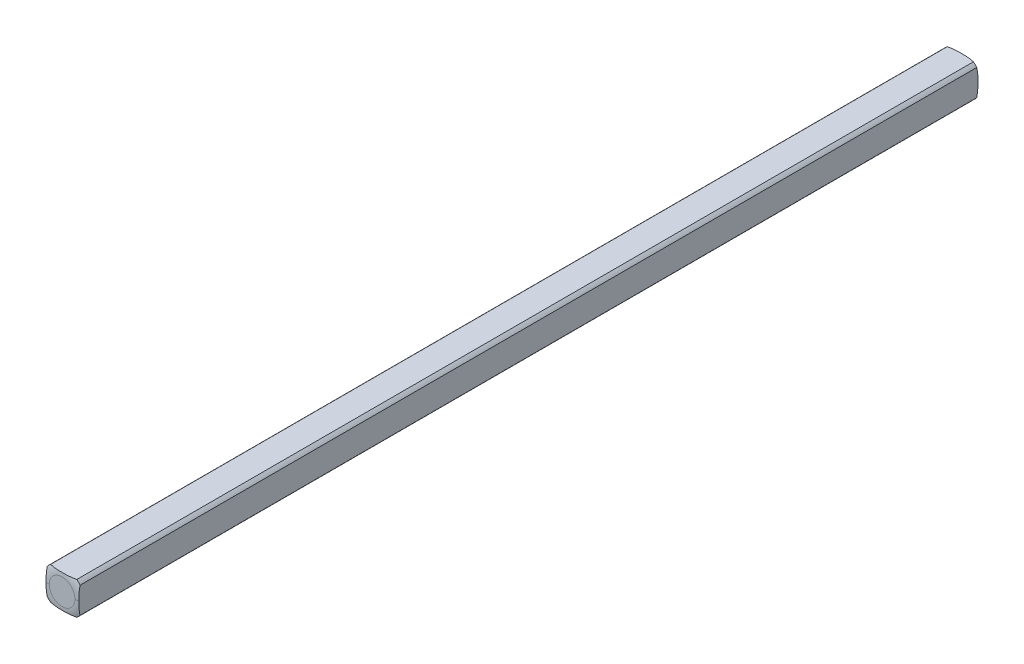
ISO-10303-21;
HEADER;
FILE_DESCRIPTION(('STEP AP214'),'2;1');
FILE_NAME('part.step','',(''),(''),'','','');
FILE_SCHEMA(('AUTOMOTIVE_DESIGN { 1 0 10303 214 1 1 1 1 }'));
ENDSEC;
DATA;
#1=APPLICATION_CONTEXT('core data for automotive mechanical design processes');
#2=APPLICATION_PROTOCOL_DEFINITION('international standard','automotive_design',2000,#1);
#3=PRODUCT_CONTEXT('',#1,'mechanical');
#4=PRODUCT('Part','Part','',(#3));
#5=PRODUCT_RELATED_PRODUCT_CATEGORY('part','',(#4));
#6=PRODUCT_DEFINITION_FORMATION('','',#4);
#7=PRODUCT_DEFINITION_CONTEXT('part definition',#1,'design');
#8=PRODUCT_DEFINITION('design','',#6,#7);
#9=PRODUCT_DEFINITION_SHAPE('','',#8);
#10=(LENGTH_UNIT() NAMED_UNIT(*) SI_UNIT(.MILLI.,.METRE.));
#11=(NAMED_UNIT(*) PLANE_ANGLE_UNIT() SI_UNIT($,.RADIAN.));
#12=(NAMED_UNIT(*) SI_UNIT($,.STERADIAN.) SOLID_ANGLE_UNIT());
#13=UNCERTAINTY_MEASURE_WITH_UNIT(LENGTH_MEASURE(1.E-05),#10,'distance_accuracy_value','');
#14=(GEOMETRIC_REPRESENTATION_CONTEXT(3) GLOBAL_UNCERTAINTY_ASSIGNED_CONTEXT((#13)) GLOBAL_UNIT_ASSIGNED_CONTEXT((#10,
#11,#12)) REPRESENTATION_CONTEXT('',''));
#15=CARTESIAN_POINT('',(0.,0.,0.));
#16=DIRECTION('',(0.,0.,1.));
#17=DIRECTION('',(1.,0.,0.));
#18=AXIS2_PLACEMENT_3D('',#15,#16,#17);
#19=CARTESIAN_POINT('',(0.,0.,-43.561));
#20=DIRECTION('',(0.,0.,1.));
#21=DIRECTION('',(1.,0.,0.));
#22=AXIS2_PLACEMENT_3D('',#19,#20,#21);
#23=CYLINDRICAL_SURFACE('',#22,2.032);
#24=CARTESIAN_POINT('',(0.,0.,-43.409919142098));
#25=DIRECTION('',(0.,0.,1.));
#26=DIRECTION('',(1.,0.,0.));
#27=AXIS2_PLACEMENT_3D('',#24,#25,#26);
#28=CIRCLE('',#27,2.032);
#29=CARTESIAN_POINT('',(-1.26841150657032,1.5875,-43.409919142098));
#30=VERTEX_POINT('',#29);
#31=CARTESIAN_POINT('',(-1.5875,1.26841150657032,-43.409919142098));
#32=VERTEX_POINT('',#31);
#33=EDGE_CURVE('E512',#30,#32,#28,.T.);
#34=ORIENTED_EDGE('',*,*,#33,.T.);
#35=DIRECTION('',(0.,0.,1.));
#36=VECTOR('',#35,1.);
#37=CARTESIAN_POINT('',(-1.5875,1.26841150657032,-43.561));
#38=LINE('',#37,#36);
#39=CARTESIAN_POINT('',(-1.5875,1.26841150657032,43.409919142098));
#40=VERTEX_POINT('',#39);
#41=EDGE_CURVE('E187',#32,#40,#38,.T.);
#42=ORIENTED_EDGE('',*,*,#41,.T.);
#43=CARTESIAN_POINT('',(0.,0.,43.409919142098));
#44=DIRECTION('',(0.,0.,-1.));
#45=DIRECTION('',(-1.,0.,0.));
#46=AXIS2_PLACEMENT_3D('',#43,#44,#45);
#47=CIRCLE('',#46,2.032);
#48=CARTESIAN_POINT('',(-1.26841150657032,1.5875,43.409919142098));
#49=VERTEX_POINT('',#48);
#50=EDGE_CURVE('E9',#40,#49,#47,.T.);
#51=ORIENTED_EDGE('',*,*,#50,.T.);
#52=DIRECTION('',(0.,0.,-1.));
#53=VECTOR('',#52,1.);
#54=CARTESIAN_POINT('',(-1.26841150657032,1.5875,-43.561));
#55=LINE('',#54,#53);
#56=EDGE_CURVE('E461',#49,#30,#55,.T.);
#57=ORIENTED_EDGE('',*,*,#56,.T.);
#58=EDGE_LOOP('',(#34,#42,#51,#57));
#59=FACE_BOUND('',#58,.T.);
#60=ADVANCED_FACE('F15',(#59),#23,.T.);
#61=CARTESIAN_POINT('',(0.,0.,-43.561));
#62=DIRECTION('',(0.,0.,1.));
#63=DIRECTION('',(1.,0.,0.));
#64=AXIS2_PLACEMENT_3D('',#61,#62,#63);
#65=CYLINDRICAL_SURFACE('',#64,2.032);
#66=CARTESIAN_POINT('',(0.,0.,-43.409919142098));
#67=DIRECTION('',(0.,0.,1.));
#68=DIRECTION('',(1.,0.,0.));
#69=AXIS2_PLACEMENT_3D('',#66,#67,#68);
#70=CIRCLE('',#69,2.032);
#71=CARTESIAN_POINT('',(1.5875,1.26841150657032,-43.409919142098));
#72=VERTEX_POINT('',#71);
#73=CARTESIAN_POINT('',(1.26841150657032,1.5875,-43.409919142098));
#74=VERTEX_POINT('',#73);
#75=EDGE_CURVE('E444',#72,#74,#70,.T.);
#76=ORIENTED_EDGE('',*,*,#75,.T.);
#77=DIRECTION('',(0.,0.,1.));
#78=VECTOR('',#77,1.);
#79=CARTESIAN_POINT('',(1.26841150657032,1.5875,-43.561));
#80=LINE('',#79,#78);
#81=CARTESIAN_POINT('',(1.26841150657032,1.5875,43.409919142098));
#82=VERTEX_POINT('',#81);
#83=EDGE_CURVE('E438',#74,#82,#80,.T.);
#84=ORIENTED_EDGE('',*,*,#83,.T.);
#85=CARTESIAN_POINT('',(0.,0.,43.409919142098));
#86=DIRECTION('',(0.,0.,-1.));
#87=DIRECTION('',(-1.,0.,0.));
#88=AXIS2_PLACEMENT_3D('',#85,#86,#87);
#89=CIRCLE('',#88,2.032);
#90=CARTESIAN_POINT('',(1.5875,1.26841150657032,43.409919142098));
#91=VERTEX_POINT('',#90);
#92=EDGE_CURVE('E27',#82,#91,#89,.T.);
#93=ORIENTED_EDGE('',*,*,#92,.T.);
#94=DIRECTION('',(0.,0.,-1.));
#95=VECTOR('',#94,1.);
#96=CARTESIAN_POINT('',(1.5875,1.26841150657032,-43.561));
#97=LINE('',#96,#95);
#98=EDGE_CURVE('E162',#91,#72,#97,.T.);
#99=ORIENTED_EDGE('',*,*,#98,.T.);
#100=EDGE_LOOP('',(#76,#84,#93,#99));
#101=FACE_BOUND('',#100,.T.);
#102=ADVANCED_FACE('F442',(#101),#65,.T.);
#103=CARTESIAN_POINT('',(0.,0.,-43.561));
#104=DIRECTION('',(0.,0.,1.));
#105=DIRECTION('',(1.,0.,0.));
#106=AXIS2_PLACEMENT_3D('',#103,#104,#105);
#107=CYLINDRICAL_SURFACE('',#106,2.032);
#108=CARTESIAN_POINT('',(0.,0.,-43.409919142098));
#109=DIRECTION('',(0.,0.,1.));
#110=DIRECTION('',(1.,0.,0.));
#111=AXIS2_PLACEMENT_3D('',#108,#109,#110);
#112=CIRCLE('',#111,2.032);
#113=CARTESIAN_POINT('',(1.26841150657032,-1.5875,-43.409919142098));
#114=VERTEX_POINT('',#113);
#115=CARTESIAN_POINT('',(1.5875,-1.26841150657032,-43.409919142098));
#116=VERTEX_POINT('',#115);
#117=EDGE_CURVE('E140',#114,#116,#112,.T.);
#118=ORIENTED_EDGE('',*,*,#117,.T.);
#119=DIRECTION('',(0.,0.,1.));
#120=VECTOR('',#119,1.);
#121=CARTESIAN_POINT('',(1.5875,-1.26841150657032,-43.561));
#122=LINE('',#121,#120);
#123=CARTESIAN_POINT('',(1.5875,-1.26841150657032,43.409919142098));
#124=VERTEX_POINT('',#123);
#125=EDGE_CURVE('E145',#116,#124,#122,.T.);
#126=ORIENTED_EDGE('',*,*,#125,.T.);
#127=CARTESIAN_POINT('',(0.,0.,43.409919142098));
#128=DIRECTION('',(0.,0.,-1.));
#129=DIRECTION('',(-1.,0.,0.));
#130=AXIS2_PLACEMENT_3D('',#127,#128,#129);
#131=CIRCLE('',#130,2.032);
#132=CARTESIAN_POINT('',(1.26841150657032,-1.5875,43.409919142098));
#133=VERTEX_POINT('',#132);
#134=EDGE_CURVE('E256',#124,#133,#131,.T.);
#135=ORIENTED_EDGE('',*,*,#134,.T.);
#136=DIRECTION('',(0.,0.,-1.));
#137=VECTOR('',#136,1.);
#138=CARTESIAN_POINT('',(1.26841150657032,-1.5875,-43.561));
#139=LINE('',#138,#137);
#140=EDGE_CURVE('E143',#133,#114,#139,.T.);
#141=ORIENTED_EDGE('',*,*,#140,.T.);
#142=EDGE_LOOP('',(#118,#126,#135,#141));
#143=FACE_BOUND('',#142,.T.);
#144=ADVANCED_FACE('F136',(#143),#107,.T.);
#145=CARTESIAN_POINT('',(0.,0.,-43.561));
#146=DIRECTION('',(0.,0.,1.));
#147=DIRECTION('',(1.,0.,0.));
#148=AXIS2_PLACEMENT_3D('',#145,#146,#147);
#149=CYLINDRICAL_SURFACE('',#148,2.032);
#150=CARTESIAN_POINT('',(0.,0.,-43.409919142098));
#151=DIRECTION('',(0.,0.,1.));
#152=DIRECTION('',(1.,0.,0.));
#153=AXIS2_PLACEMENT_3D('',#150,#151,#152);
#154=CIRCLE('',#153,2.032);
#155=CARTESIAN_POINT('',(-1.5875,-1.26841150657032,-43.409919142098));
#156=VERTEX_POINT('',#155);
#157=CARTESIAN_POINT('',(-1.26841150657032,-1.5875,-43.409919142098));
#158=VERTEX_POINT('',#157);
#159=EDGE_CURVE('E146',#156,#158,#154,.T.);
#160=ORIENTED_EDGE('',*,*,#159,.T.);
#161=DIRECTION('',(0.,0.,1.));
#162=VECTOR('',#161,1.);
#163=CARTESIAN_POINT('',(-1.26841150657032,-1.5875,-43.561));
#164=LINE('',#163,#162);
#165=CARTESIAN_POINT('',(-1.26841150657032,-1.5875,43.409919142098));
#166=VERTEX_POINT('',#165);
#167=EDGE_CURVE('E362',#158,#166,#164,.T.);
#168=ORIENTED_EDGE('',*,*,#167,.T.);
#169=CARTESIAN_POINT('',(0.,0.,43.409919142098));
#170=DIRECTION('',(0.,0.,-1.));
#171=DIRECTION('',(-1.,0.,0.));
#172=AXIS2_PLACEMENT_3D('',#169,#170,#171);
#173=CIRCLE('',#172,2.032);
#174=CARTESIAN_POINT('',(-1.5875,-1.26841150657032,43.409919142098));
#175=VERTEX_POINT('',#174);
#176=EDGE_CURVE('E234',#166,#175,#173,.T.);
#177=ORIENTED_EDGE('',*,*,#176,.T.);
#178=DIRECTION('',(0.,0.,-1.));
#179=VECTOR('',#178,1.);
#180=CARTESIAN_POINT('',(-1.5875,-1.26841150657032,-43.561));
#181=LINE('',#180,#179);
#182=EDGE_CURVE('E376',#175,#156,#181,.T.);
#183=ORIENTED_EDGE('',*,*,#182,.T.);
#184=EDGE_LOOP('',(#160,#168,#177,#183));
#185=FACE_BOUND('',#184,.T.);
#186=ADVANCED_FACE('F665',(#185),#149,.T.);
#187=CARTESIAN_POINT('',(-1.5875,1.5875,43.561));
#188=DIRECTION('',(0.,0.,-1.));
#189=DIRECTION('',(0.,-1.,0.));
#190=AXIS2_PLACEMENT_3D('',#187,#188,#189);
#191=PLANE('',#190);
#192=CARTESIAN_POINT('',(0.,0.,43.561));
#193=DIRECTION('',(0.,0.,1.));
#194=DIRECTION('',(1.,0.,0.));
#195=AXIS2_PLACEMENT_3D('',#192,#193,#194);
#196=CIRCLE('',#195,1.24506403026729);
#197=CARTESIAN_POINT('',(1.24506403026729,0.,43.561));
#198=VERTEX_POINT('',#197);
#199=CARTESIAN_POINT('',(-1.24506403026729,0.,43.561));
#200=VERTEX_POINT('',#199);
#201=EDGE_CURVE('E356',#198,#200,#196,.T.);
#202=ORIENTED_EDGE('',*,*,#201,.T.);
#203=CARTESIAN_POINT('',(0.,0.,43.561));
#204=DIRECTION('',(0.,0.,1.));
#205=DIRECTION('',(1.,0.,0.));
#206=AXIS2_PLACEMENT_3D('',#203,#204,#205);
#207=CIRCLE('',#206,1.24506403026729);
#208=EDGE_CURVE('E297',#200,#198,#207,.T.);
#209=ORIENTED_EDGE('',*,*,#208,.T.);
#210=EDGE_LOOP('',(#202,#209));
#211=FACE_BOUND('',#210,.T.);
#212=ADVANCED_FACE('F680',(#211),#191,.F.);
#213=CARTESIAN_POINT('',(-1.5875,1.5875,-43.561));
#214=DIRECTION('',(0.,0.,-1.));
#215=DIRECTION('',(0.,-1.,0.));
#216=AXIS2_PLACEMENT_3D('',#213,#214,#215);
#217=PLANE('',#216);
#218=CARTESIAN_POINT('',(0.,0.,-43.561));
#219=DIRECTION('',(0.,0.,1.));
#220=DIRECTION('',(1.,0.,0.));
#221=AXIS2_PLACEMENT_3D('',#218,#219,#220);
#222=CIRCLE('',#221,1.24506403026729);
#223=CARTESIAN_POINT('',(1.24506403026729,0.,-43.561));
#224=VERTEX_POINT('',#223);
#225=CARTESIAN_POINT('',(-1.24506403026729,0.,-43.561));
#226=VERTEX_POINT('',#225);
#227=EDGE_CURVE('E425',#224,#226,#222,.T.);
#228=ORIENTED_EDGE('',*,*,#227,.F.);
#229=CARTESIAN_POINT('',(0.,0.,-43.561));
#230=DIRECTION('',(0.,0.,1.));
#231=DIRECTION('',(1.,0.,0.));
#232=AXIS2_PLACEMENT_3D('',#229,#230,#231);
#233=CIRCLE('',#232,1.24506403026729);
#234=EDGE_CURVE('E148',#226,#224,#233,.T.);
#235=ORIENTED_EDGE('',*,*,#234,.F.);
#236=EDGE_LOOP('',(#228,#235));
#237=FACE_BOUND('',#236,.T.);
#238=ADVANCED_FACE('F343',(#237),#217,.T.);
#239=CARTESIAN_POINT('',(0.,0.,41.436));
#240=DIRECTION('',(0.,0.,-1.));
#241=DIRECTION('',(1.,0.,0.));
#242=AXIS2_PLACEMENT_3D('',#239,#240,#241);
#243=DEGENERATE_TOROIDAL_SURFACE('',#242,1.24506403026729,2.125,.T.);
#244=CARTESIAN_POINT('',(-1.24506403026729,0.,41.436));
#245=DIRECTION('',(0.,-1.,0.));
#246=DIRECTION('',(1.,0.,0.));
#247=AXIS2_PLACEMENT_3D('',#244,#245,#246);
#248=CIRCLE('',#247,2.125);
#249=CARTESIAN_POINT('',(-1.5875,0.,43.5332273616929));
#250=VERTEX_POINT('',#249);
#251=EDGE_CURVE('E288',#200,#250,#248,.T.);
#252=ORIENTED_EDGE('',*,*,#251,.F.);
#253=ORIENTED_EDGE('',*,*,#201,.F.);
#254=CARTESIAN_POINT('',(1.24506403026729,0.,41.436));
#255=DIRECTION('',(0.,1.,0.));
#256=DIRECTION('',(0.,0.,1.));
#257=AXIS2_PLACEMENT_3D('',#254,#255,#256);
#258=CIRCLE('',#257,2.125);
#259=CARTESIAN_POINT('',(1.5875,0.,43.5332273616929));
#260=VERTEX_POINT('',#259);
#261=EDGE_CURVE('E273',#198,#260,#258,.T.);
#262=ORIENTED_EDGE('',*,*,#261,.T.);
#263=CARTESIAN_POINT('',(1.5875,1.26841150657033,43.409919142098));
#264=CARTESIAN_POINT('',(1.5875,0.987077094955315,43.4799306391243));
#265=CARTESIAN_POINT('',(1.5875,0.63953045901757,43.5091819538897));
#266=CARTESIAN_POINT('',(1.5875,0.35383729757252,43.5332273616929));
#267=CARTESIAN_POINT('',(1.5875,0.,43.5332273616929));
#268=B_SPLINE_CURVE_WITH_KNOTS('',2,(#263,#264,#265,#266,#267),.UNSPECIFIED.,.F.,.F.,(3,2,3),
(0.,0.5,1.),.UNSPECIFIED.);
#269=EDGE_CURVE('E428',#91,#260,#268,.T.);
#270=ORIENTED_EDGE('',*,*,#269,.F.);
#271=ORIENTED_EDGE('',*,*,#92,.F.);
#272=CARTESIAN_POINT('',(-1.26841150657032,1.5875,43.409919142098));
#273=CARTESIAN_POINT('',(-0.77033823217975,1.5875,43.5338672057874));
#274=CARTESIAN_POINT('',(0.00849337593367507,1.5875,43.5332236517902));
#275=CARTESIAN_POINT('',(0.77547099042888,1.5875,43.5325898928308));
#276=CARTESIAN_POINT('',(1.26841150657033,1.5875,43.409919142098));
#277=B_SPLINE_CURVE_WITH_KNOTS('',2,(#272,#273,#274,#275,#276),.UNSPECIFIED.,.F.,.F.,(3,2,3),
(0.,0.5,1.),.UNSPECIFIED.);
#278=EDGE_CURVE('E468',#49,#82,#277,.T.);
#279=ORIENTED_EDGE('',*,*,#278,.F.);
#280=ORIENTED_EDGE('',*,*,#50,.F.);
#281=CARTESIAN_POINT('',(-1.5875,0.,43.5332273616929));
#282=CARTESIAN_POINT('',(-1.5875,0.35317995739202,43.5332273616929));
#283=CARTESIAN_POINT('',(-1.5875,0.6395293222865,43.5091820494506));
#284=CARTESIAN_POINT('',(-1.5875,0.986669843239065,43.4800319857816));
#285=CARTESIAN_POINT('',(-1.5875,1.26841150657033,43.409919142098));
#286=B_SPLINE_CURVE_WITH_KNOTS('',2,(#281,#282,#283,#284,#285),.UNSPECIFIED.,.F.,.F.,(3,2,3),
(0.,0.5,1.),.UNSPECIFIED.);
#287=EDGE_CURVE('E365',#250,#40,#286,.T.);
#288=ORIENTED_EDGE('',*,*,#287,.F.);
#289=EDGE_LOOP('',(#252,#253,#262,#270,#271,#279,#280,#288));
#290=FACE_BOUND('',#289,.T.);
#291=ADVANCED_FACE('F249',(#290),#243,.T.);
#292=CARTESIAN_POINT('',(0.,0.,-41.436));
#293=DIRECTION('',(0.,0.,1.));
#294=DIRECTION('',(1.,0.,0.));
#295=AXIS2_PLACEMENT_3D('',#292,#293,#294);
#296=DEGENERATE_TOROIDAL_SURFACE('',#295,1.24506403026729,2.125,.T.);
#297=CARTESIAN_POINT('',(-1.24506403026729,0.,-41.436));
#298=DIRECTION('',(0.,1.,0.));
#299=DIRECTION('',(-1.,0.,0.));
#300=AXIS2_PLACEMENT_3D('',#297,#298,#299);
#301=CIRCLE('',#300,2.125);
#302=CARTESIAN_POINT('',(-1.5875,0.,-43.5332273616929));
#303=VERTEX_POINT('',#302);
#304=EDGE_CURVE('E331',#226,#303,#301,.T.);
#305=ORIENTED_EDGE('',*,*,#304,.F.);
#306=ORIENTED_EDGE('',*,*,#234,.T.);
#307=CARTESIAN_POINT('',(1.24506403026729,0.,-41.436));
#308=DIRECTION('',(0.,-1.,0.));
#309=DIRECTION('',(0.,0.,-1.));
#310=AXIS2_PLACEMENT_3D('',#307,#308,#309);
#311=CIRCLE('',#310,2.125);
#312=CARTESIAN_POINT('',(1.5875,0.,-43.5332273616929));
#313=VERTEX_POINT('',#312);
#314=EDGE_CURVE('E156',#224,#313,#311,.T.);
#315=ORIENTED_EDGE('',*,*,#314,.T.);
#316=CARTESIAN_POINT('',(1.5875,-1.26841150657032,-43.409919142098));
#317=CARTESIAN_POINT('',(1.5875,-0.987077094955249,-43.4799306391243));
#318=CARTESIAN_POINT('',(1.5875,-0.63953045901757,-43.5091819538897));
#319=CARTESIAN_POINT('',(1.5875,-0.35383729757271,-43.5332273616929));
#320=CARTESIAN_POINT('',(1.5875,0.,-43.5332273616929));
#321=B_SPLINE_CURVE_WITH_KNOTS('',2,(#316,#317,#318,#319,#320),.UNSPECIFIED.,.F.,.F.,(3,2,3),
(0.,0.5,1.),.UNSPECIFIED.);
#322=EDGE_CURVE('E151',#116,#313,#321,.T.);
#323=ORIENTED_EDGE('',*,*,#322,.F.);
#324=ORIENTED_EDGE('',*,*,#117,.F.);
#325=CARTESIAN_POINT('',(-1.26841150657032,-1.5875,-43.409919142098));
#326=CARTESIAN_POINT('',(-0.770338232200794,-1.5875,-43.5338672057821));
#327=CARTESIAN_POINT('',(0.00849337593367507,-1.5875,-43.5332236517903));
#328=CARTESIAN_POINT('',(0.77547099040777,-1.5875,-43.5325898928361));
#329=CARTESIAN_POINT('',(1.26841150657033,-1.5875,-43.409919142098));
#330=B_SPLINE_CURVE_WITH_KNOTS('',2,(#325,#326,#327,#328,#329),.UNSPECIFIED.,.F.,.F.,(3,2,3),
(0.,0.5,1.),.UNSPECIFIED.);
#331=EDGE_CURVE('E180',#158,#114,#330,.T.);
#332=ORIENTED_EDGE('',*,*,#331,.F.);
#333=ORIENTED_EDGE('',*,*,#159,.F.);
#334=CARTESIAN_POINT('',(-1.5875,0.,-43.5332273616929));
#335=CARTESIAN_POINT('',(-1.5875,-0.353179957370392,-43.5332273616929));
#336=CARTESIAN_POINT('',(-1.5875,-0.639529322286498,-43.5091820494506));
#337=CARTESIAN_POINT('',(-1.5875,-0.986669843225619,-43.480031985785));
#338=CARTESIAN_POINT('',(-1.5875,-1.26841150657032,-43.409919142098));
#339=B_SPLINE_CURVE_WITH_KNOTS('',2,(#334,#335,#336,#337,#338),.UNSPECIFIED.,.F.,.F.,(3,2,3),
(0.,0.5,1.),.UNSPECIFIED.);
#340=EDGE_CURVE('E312',#303,#156,#339,.T.);
#341=ORIENTED_EDGE('',*,*,#340,.F.);
#342=EDGE_LOOP('',(#305,#306,#315,#323,#324,#332,#333,#341));
#343=FACE_BOUND('',#342,.T.);
#344=ADVANCED_FACE('F158',(#343),#296,.T.);
#345=CARTESIAN_POINT('',(-1.5875,1.5875,43.561));
#346=DIRECTION('',(0.,-1.,0.));
#347=DIRECTION('',(0.,0.,-1.));
#348=AXIS2_PLACEMENT_3D('',#345,#346,#347);
#349=PLANE('',#348);
#350=ORIENTED_EDGE('',*,*,#83,.F.);
#351=CARTESIAN_POINT('',(1.26841150657033,1.5875,-43.409919142098));
#352=CARTESIAN_POINT('',(0.770338232200795,1.5875,-43.5338672057821));
#353=CARTESIAN_POINT('',(-0.00849337593366987,1.5875,-43.5332236517903));
#354=CARTESIAN_POINT('',(-0.775470990407769,1.5875,-43.5325898928361));
#355=CARTESIAN_POINT('',(-1.26841150657032,1.5875,-43.409919142098));
#356=B_SPLINE_CURVE_WITH_KNOTS('',2,(#351,#352,#353,#354,#355),.UNSPECIFIED.,.F.,.F.,(3,2,3),
(0.,0.5,1.),.UNSPECIFIED.);
#357=EDGE_CURVE('E518',#74,#30,#356,.T.);
#358=ORIENTED_EDGE('',*,*,#357,.T.);
#359=ORIENTED_EDGE('',*,*,#56,.F.);
#360=ORIENTED_EDGE('',*,*,#278,.T.);
#361=EDGE_LOOP('',(#350,#358,#359,#360));
#362=FACE_BOUND('',#361,.T.);
#363=ADVANCED_FACE('F213',(#362),#349,.F.);
#364=CARTESIAN_POINT('',(1.5875,-1.5875,43.561));
#365=DIRECTION('',(-1.,0.,0.));
#366=DIRECTION('',(0.,0.,1.));
#367=AXIS2_PLACEMENT_3D('',#364,#365,#366);
#368=PLANE('',#367);
#369=ORIENTED_EDGE('',*,*,#125,.F.);
#370=ORIENTED_EDGE('',*,*,#322,.T.);
#371=CARTESIAN_POINT('',(1.5875,0.,-43.5332273616929));
#372=CARTESIAN_POINT('',(1.5875,0.353179957370335,-43.5332273616929));
#373=CARTESIAN_POINT('',(1.5875,0.6395293222865,-43.5091820494506));
#374=CARTESIAN_POINT('',(1.5875,0.986669843225585,-43.480031985785));
#375=CARTESIAN_POINT('',(1.5875,1.26841150657033,-43.409919142098));
#376=B_SPLINE_CURVE_WITH_KNOTS('',2,(#371,#372,#373,#374,#375),.UNSPECIFIED.,.F.,.F.,(3,2,3),
(0.,0.5,1.),.UNSPECIFIED.);
#377=EDGE_CURVE('E190',#313,#72,#376,.T.);
#378=ORIENTED_EDGE('',*,*,#377,.T.);
#379=ORIENTED_EDGE('',*,*,#98,.F.);
#380=ORIENTED_EDGE('',*,*,#269,.T.);
#381=CARTESIAN_POINT('',(1.5875,0.,43.5332273616929));
#382=CARTESIAN_POINT('',(1.5875,-0.353179957326938,43.5332273616929));
#383=CARTESIAN_POINT('',(1.5875,-0.639529322286498,43.5091820494506));
#384=CARTESIAN_POINT('',(1.5875,-0.986669843198375,43.4800319857917));
#385=CARTESIAN_POINT('',(1.5875,-1.26841150657032,43.409919142098));
#386=B_SPLINE_CURVE_WITH_KNOTS('',2,(#381,#382,#383,#384,#385),.UNSPECIFIED.,.F.,.F.,(3,2,3),
(0.,0.5,1.),.UNSPECIFIED.);
#387=EDGE_CURVE('E167',#260,#124,#386,.T.);
#388=ORIENTED_EDGE('',*,*,#387,.T.);
#389=EDGE_LOOP('',(#369,#370,#378,#379,#380,#388));
#390=FACE_BOUND('',#389,.T.);
#391=ADVANCED_FACE('F170',(#390),#368,.F.);
#392=CARTESIAN_POINT('',(-1.5875,-1.5875,43.561));
#393=DIRECTION('',(0.,1.,0.));
#394=DIRECTION('',(1.,0.,0.));
#395=AXIS2_PLACEMENT_3D('',#392,#393,#394);
#396=PLANE('',#395);
#397=ORIENTED_EDGE('',*,*,#167,.F.);
#398=ORIENTED_EDGE('',*,*,#331,.T.);
#399=ORIENTED_EDGE('',*,*,#140,.F.);
#400=CARTESIAN_POINT('',(1.26841150657033,-1.5875,43.409919142098));
#401=CARTESIAN_POINT('',(0.77033823217975,-1.5875,43.5338672057874));
#402=CARTESIAN_POINT('',(-0.00849337593367486,-1.5875,43.5332236517902));
#403=CARTESIAN_POINT('',(-0.775470990428877,-1.5875,43.5325898928308));
#404=CARTESIAN_POINT('',(-1.26841150657032,-1.5875,43.409919142098));
#405=B_SPLINE_CURVE_WITH_KNOTS('',2,(#400,#401,#402,#403,#404),.UNSPECIFIED.,.F.,.F.,(3,2,3),
(0.,0.5,1.),.UNSPECIFIED.);
#406=EDGE_CURVE('E231',#133,#166,#405,.T.);
#407=ORIENTED_EDGE('',*,*,#406,.T.);
#408=EDGE_LOOP('',(#397,#398,#399,#407));
#409=FACE_BOUND('',#408,.T.);
#410=ADVANCED_FACE('F199',(#409),#396,.F.);
#411=CARTESIAN_POINT('',(-1.5875,-1.5875,43.561));
#412=DIRECTION('',(1.,0.,0.));
#413=DIRECTION('',(0.,1.,0.));
#414=AXIS2_PLACEMENT_3D('',#411,#412,#413);
#415=PLANE('',#414);
#416=ORIENTED_EDGE('',*,*,#41,.F.);
#417=CARTESIAN_POINT('',(-1.5875,1.26841150657033,-43.409919142098));
#418=CARTESIAN_POINT('',(-1.5875,0.98707709495523,-43.4799306391243));
#419=CARTESIAN_POINT('',(-1.5875,0.63953045901757,-43.5091819538897));
#420=CARTESIAN_POINT('',(-1.5875,0.353837297572685,-43.5332273616929));
#421=CARTESIAN_POINT('',(-1.5875,0.,-43.5332273616929));
#422=B_SPLINE_CURVE_WITH_KNOTS('',2,(#417,#418,#419,#420,#421),.UNSPECIFIED.,.F.,.F.,(3,2,3),
(0.,0.5,1.),.UNSPECIFIED.);
#423=EDGE_CURVE('E509',#32,#303,#422,.T.);
#424=ORIENTED_EDGE('',*,*,#423,.T.);
#425=ORIENTED_EDGE('',*,*,#340,.T.);
#426=ORIENTED_EDGE('',*,*,#182,.F.);
#427=CARTESIAN_POINT('',(-1.5875,-1.26841150657032,43.409919142098));
#428=CARTESIAN_POINT('',(-1.5875,-0.987077094955333,43.4799306391243));
#429=CARTESIAN_POINT('',(-1.5875,-0.63953045901757,43.5091819538897));
#430=CARTESIAN_POINT('',(-1.5875,-0.353837297572546,43.5332273616929));
#431=CARTESIAN_POINT('',(-1.5875,0.,43.5332273616929));
#432=B_SPLINE_CURVE_WITH_KNOTS('',2,(#427,#428,#429,#430,#431),.UNSPECIFIED.,.F.,.F.,(3,2,3),
(0.,0.5,1.),.UNSPECIFIED.);
#433=EDGE_CURVE('E279',#175,#250,#432,.T.);
#434=ORIENTED_EDGE('',*,*,#433,.T.);
#435=ORIENTED_EDGE('',*,*,#287,.T.);
#436=EDGE_LOOP('',(#416,#424,#425,#426,#434,#435));
#437=FACE_BOUND('',#436,.T.);
#438=ADVANCED_FACE('F210',(#437),#415,.F.);
#439=CARTESIAN_POINT('',(0.,0.,-41.436));
#440=DIRECTION('',(0.,0.,1.));
#441=DIRECTION('',(1.,0.,0.));
#442=AXIS2_PLACEMENT_3D('',#439,#440,#441);
#443=DEGENERATE_TOROIDAL_SURFACE('',#442,1.24506403026729,2.125,.T.);
#444=ORIENTED_EDGE('',*,*,#227,.T.);
#445=ORIENTED_EDGE('',*,*,#304,.T.);
#446=ORIENTED_EDGE('',*,*,#423,.F.);
#447=ORIENTED_EDGE('',*,*,#33,.F.);
#448=ORIENTED_EDGE('',*,*,#357,.F.);
#449=ORIENTED_EDGE('',*,*,#75,.F.);
#450=ORIENTED_EDGE('',*,*,#377,.F.);
#451=ORIENTED_EDGE('',*,*,#314,.F.);
#452=EDGE_LOOP('',(#444,#445,#446,#447,#448,#449,#450,#451));
#453=FACE_BOUND('',#452,.T.);
#454=ADVANCED_FACE('F250',(#453),#443,.T.);
#455=CARTESIAN_POINT('',(0.,0.,41.436));
#456=DIRECTION('',(0.,0.,-1.));
#457=DIRECTION('',(1.,0.,0.));
#458=AXIS2_PLACEMENT_3D('',#455,#456,#457);
#459=DEGENERATE_TOROIDAL_SURFACE('',#458,1.24506403026729,2.125,.T.);
#460=ORIENTED_EDGE('',*,*,#208,.F.);
#461=ORIENTED_EDGE('',*,*,#251,.T.);
#462=ORIENTED_EDGE('',*,*,#433,.F.);
#463=ORIENTED_EDGE('',*,*,#176,.F.);
#464=ORIENTED_EDGE('',*,*,#406,.F.);
#465=ORIENTED_EDGE('',*,*,#134,.F.);
#466=ORIENTED_EDGE('',*,*,#387,.F.);
#467=ORIENTED_EDGE('',*,*,#261,.F.);
#468=EDGE_LOOP('',(#460,#461,#462,#463,#464,#465,#466,#467));
#469=FACE_BOUND('',#468,.T.);
#470=ADVANCED_FACE('F240',(#469),#459,.T.);
#471=CLOSED_SHELL('',(#60,#102,#144,#186,#212,#238,#291,#344,#363,#391,#410,#438,#454,#470));
#472=MANIFOLD_SOLID_BREP('B1',#471);
#473=ADVANCED_BREP_SHAPE_REPRESENTATION('',(#18,#472),#14);
#474=SHAPE_DEFINITION_REPRESENTATION(#9,#473);
ENDSEC;
END-ISO-10303-21;
